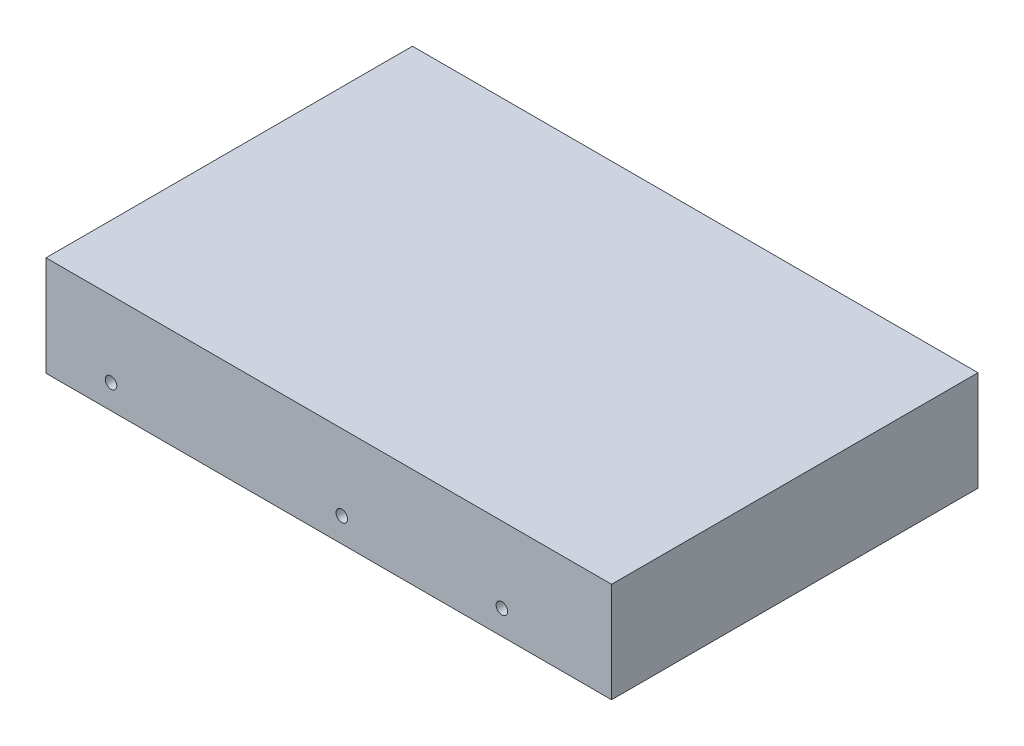
ISO-10303-21;
HEADER;
FILE_DESCRIPTION(('STEP AP214'),'2;1');
FILE_NAME('part.step','',(''),(''),'','','');
FILE_SCHEMA(('AUTOMOTIVE_DESIGN { 1 0 10303 214 1 1 1 1 }'));
ENDSEC;
DATA;
#1=APPLICATION_CONTEXT('core data for automotive mechanical design processes');
#2=APPLICATION_PROTOCOL_DEFINITION('international standard','automotive_design',2000,#1);
#3=PRODUCT_CONTEXT('',#1,'mechanical');
#4=PRODUCT('Part','Part','',(#3));
#5=PRODUCT_RELATED_PRODUCT_CATEGORY('part','',(#4));
#6=PRODUCT_DEFINITION_FORMATION('','',#4);
#7=PRODUCT_DEFINITION_CONTEXT('part definition',#1,'design');
#8=PRODUCT_DEFINITION('design','',#6,#7);
#9=PRODUCT_DEFINITION_SHAPE('','',#8);
#10=(LENGTH_UNIT() NAMED_UNIT(*) SI_UNIT(.MILLI.,.METRE.));
#11=(NAMED_UNIT(*) PLANE_ANGLE_UNIT() SI_UNIT($,.RADIAN.));
#12=(NAMED_UNIT(*) SI_UNIT($,.STERADIAN.) SOLID_ANGLE_UNIT());
#13=UNCERTAINTY_MEASURE_WITH_UNIT(LENGTH_MEASURE(1.E-05),#10,'distance_accuracy_value','');
#14=(GEOMETRIC_REPRESENTATION_CONTEXT(3) GLOBAL_UNCERTAINTY_ASSIGNED_CONTEXT((#13)) GLOBAL_UNIT_ASSIGNED_CONTEXT((#10,
#11,#12)) REPRESENTATION_CONTEXT('',''));
#15=CARTESIAN_POINT('',(0.,0.,0.));
#16=DIRECTION('',(0.,0.,1.));
#17=DIRECTION('',(1.,0.,0.));
#18=AXIS2_PLACEMENT_3D('',#15,#16,#17);
#19=CARTESIAN_POINT('',(-65.3799342105263,26.,-55.8758223684211));
#20=DIRECTION('',(1.,0.,0.));
#21=DIRECTION('',(0.,0.,-1.));
#22=AXIS2_PLACEMENT_3D('',#19,#20,#21);
#23=PLANE('',#22);
#24=DIRECTION('',(0.,0.,1.));
#25=VECTOR('',#24,1.);
#26=CARTESIAN_POINT('',(-65.3799342105263,0.,-55.8758223684211));
#27=LINE('',#26,#25);
#28=CARTESIAN_POINT('',(-65.3799342105263,0.,-55.8758223684211));
#29=VERTEX_POINT('',#28);
#30=CARTESIAN_POINT('',(-65.3799342105263,0.,39.3741776315789));
#31=VERTEX_POINT('',#30);
#32=EDGE_CURVE('E96',#29,#31,#27,.T.);
#33=ORIENTED_EDGE('',*,*,#32,.T.);
#34=DIRECTION('',(0.,-1.,0.));
#35=VECTOR('',#34,1.);
#36=CARTESIAN_POINT('',(-65.3799342105263,26.,39.3741776315789));
#37=LINE('',#36,#35);
#38=CARTESIAN_POINT('',(-65.3799342105263,26.,39.3741776315789));
#39=VERTEX_POINT('',#38);
#40=EDGE_CURVE('E11',#39,#31,#37,.T.);
#41=ORIENTED_EDGE('',*,*,#40,.F.);
#42=DIRECTION('',(0.,0.,1.));
#43=VECTOR('',#42,1.);
#44=CARTESIAN_POINT('',(-65.3799342105263,26.,-55.8758223684211));
#45=LINE('',#44,#43);
#46=CARTESIAN_POINT('',(-65.3799342105263,26.,-55.8758223684211));
#47=VERTEX_POINT('',#46);
#48=EDGE_CURVE('E84',#47,#39,#45,.T.);
#49=ORIENTED_EDGE('',*,*,#48,.F.);
#50=DIRECTION('',(0.,-1.,0.));
#51=VECTOR('',#50,1.);
#52=CARTESIAN_POINT('',(-65.3799342105263,26.,-55.8758223684211));
#53=LINE('',#52,#51);
#54=EDGE_CURVE('E92',#47,#29,#53,.T.);
#55=ORIENTED_EDGE('',*,*,#54,.T.);
#56=EDGE_LOOP('',(#33,#41,#49,#55));
#57=FACE_BOUND('',#56,.T.);
#58=ADVANCED_FACE('F33',(#57),#23,.F.);
#59=CARTESIAN_POINT('',(-65.3799342105263,26.,39.3741776315789));
#60=DIRECTION('',(0.,0.,-1.));
#61=DIRECTION('',(-1.,0.,0.));
#62=AXIS2_PLACEMENT_3D('',#59,#60,#61);
#63=PLANE('',#62);
#64=CARTESIAN_POINT('',(11.5100657894737,6.34999999999999,39.3741776315789));
#65=DIRECTION('',(0.,0.,1.));
#66=DIRECTION('',(1.,0.,0.));
#67=AXIS2_PLACEMENT_3D('',#64,#65,#66);
#68=CIRCLE('',#67,1.5);
#69=CARTESIAN_POINT('',(13.0100657894737,6.34999999999999,39.3741776315789));
#70=VERTEX_POINT('',#69);
#71=EDGE_CURVE('E113',#70,#70,#68,.T.);
#72=ORIENTED_EDGE('',*,*,#71,.F.);
#73=EDGE_LOOP('',(#72));
#74=FACE_BOUND('',#73,.T.);
#75=CARTESIAN_POINT('',(-48.4799342105263,6.34999999999999,39.3741776315789));
#76=DIRECTION('',(0.,0.,1.));
#77=DIRECTION('',(1.,0.,0.));
#78=AXIS2_PLACEMENT_3D('',#75,#76,#77);
#79=CIRCLE('',#78,1.5);
#80=CARTESIAN_POINT('',(-46.9799342105263,6.34999999999999,39.3741776315789));
#81=VERTEX_POINT('',#80);
#82=EDGE_CURVE('E119',#81,#81,#79,.T.);
#83=ORIENTED_EDGE('',*,*,#82,.F.);
#84=EDGE_LOOP('',(#83));
#85=FACE_BOUND('',#84,.T.);
#86=CARTESIAN_POINT('',(53.1200657894737,6.35,39.3741776315789));
#87=DIRECTION('',(0.,0.,1.));
#88=DIRECTION('',(1.,0.,0.));
#89=AXIS2_PLACEMENT_3D('',#86,#87,#88);
#90=CIRCLE('',#89,1.5);
#91=CARTESIAN_POINT('',(54.6200657894737,6.35,39.3741776315789));
#92=VERTEX_POINT('',#91);
#93=EDGE_CURVE('E110',#92,#92,#90,.T.);
#94=ORIENTED_EDGE('',*,*,#93,.F.);
#95=EDGE_LOOP('',(#94));
#96=FACE_BOUND('',#95,.T.);
#97=DIRECTION('',(1.,0.,0.));
#98=VECTOR('',#97,1.);
#99=CARTESIAN_POINT('',(-65.3799342105263,0.,39.3741776315789));
#100=LINE('',#99,#98);
#101=CARTESIAN_POINT('',(81.6200657894737,0.,39.3741776315789));
#102=VERTEX_POINT('',#101);
#103=EDGE_CURVE('E88',#31,#102,#100,.T.);
#104=ORIENTED_EDGE('',*,*,#103,.T.);
#105=DIRECTION('',(0.,-1.,0.));
#106=VECTOR('',#105,1.);
#107=CARTESIAN_POINT('',(81.6200657894737,26.,39.3741776315789));
#108=LINE('',#107,#106);
#109=CARTESIAN_POINT('',(81.6200657894737,26.,39.3741776315789));
#110=VERTEX_POINT('',#109);
#111=EDGE_CURVE('E41',#110,#102,#108,.T.);
#112=ORIENTED_EDGE('',*,*,#111,.F.);
#113=DIRECTION('',(1.,0.,0.));
#114=VECTOR('',#113,1.);
#115=CARTESIAN_POINT('',(-65.3799342105263,26.,39.3741776315789));
#116=LINE('',#115,#114);
#117=EDGE_CURVE('E79',#39,#110,#116,.T.);
#118=ORIENTED_EDGE('',*,*,#117,.F.);
#119=ORIENTED_EDGE('',*,*,#40,.T.);
#120=EDGE_LOOP('',(#104,#112,#118,#119));
#121=FACE_BOUND('',#120,.T.);
#122=ADVANCED_FACE('F87',(#74,#85,#96,#121),#63,.F.);
#123=CARTESIAN_POINT('',(81.6200657894737,26.,-55.8758223684211));
#124=DIRECTION('',(-1.,0.,0.));
#125=DIRECTION('',(0.,0.,1.));
#126=AXIS2_PLACEMENT_3D('',#123,#124,#125);
#127=PLANE('',#126);
#128=DIRECTION('',(0.,0.,-1.));
#129=VECTOR('',#128,1.);
#130=CARTESIAN_POINT('',(81.6200657894737,0.,-55.8758223684211));
#131=LINE('',#130,#129);
#132=CARTESIAN_POINT('',(81.6200657894737,0.,-55.8758223684211));
#133=VERTEX_POINT('',#132);
#134=EDGE_CURVE('E66',#102,#133,#131,.T.);
#135=ORIENTED_EDGE('',*,*,#134,.T.);
#136=DIRECTION('',(0.,-1.,0.));
#137=VECTOR('',#136,1.);
#138=CARTESIAN_POINT('',(81.6200657894737,26.,-55.8758223684211));
#139=LINE('',#138,#137);
#140=CARTESIAN_POINT('',(81.6200657894737,26.,-55.8758223684211));
#141=VERTEX_POINT('',#140);
#142=EDGE_CURVE('E89',#141,#133,#139,.T.);
#143=ORIENTED_EDGE('',*,*,#142,.F.);
#144=DIRECTION('',(0.,0.,-1.));
#145=VECTOR('',#144,1.);
#146=CARTESIAN_POINT('',(81.6200657894737,26.,-55.8758223684211));
#147=LINE('',#146,#145);
#148=EDGE_CURVE('E82',#110,#141,#147,.T.);
#149=ORIENTED_EDGE('',*,*,#148,.F.);
#150=ORIENTED_EDGE('',*,*,#111,.T.);
#151=EDGE_LOOP('',(#135,#143,#149,#150));
#152=FACE_BOUND('',#151,.T.);
#153=ADVANCED_FACE('F90',(#152),#127,.F.);
#154=CARTESIAN_POINT('',(-65.3799342105263,26.,-55.8758223684211));
#155=DIRECTION('',(0.,0.,1.));
#156=DIRECTION('',(1.,0.,0.));
#157=AXIS2_PLACEMENT_3D('',#154,#155,#156);
#158=PLANE('',#157);
#159=DIRECTION('',(-1.,0.,0.));
#160=VECTOR('',#159,1.);
#161=CARTESIAN_POINT('',(-65.3799342105263,0.,-55.8758223684211));
#162=LINE('',#161,#160);
#163=EDGE_CURVE('E72',#133,#29,#162,.T.);
#164=ORIENTED_EDGE('',*,*,#163,.T.);
#165=ORIENTED_EDGE('',*,*,#54,.F.);
#166=DIRECTION('',(-1.,0.,0.));
#167=VECTOR('',#166,1.);
#168=CARTESIAN_POINT('',(-65.3799342105263,26.,-55.8758223684211));
#169=LINE('',#168,#167);
#170=EDGE_CURVE('E49',#141,#47,#169,.T.);
#171=ORIENTED_EDGE('',*,*,#170,.F.);
#172=ORIENTED_EDGE('',*,*,#142,.T.);
#173=EDGE_LOOP('',(#164,#165,#171,#172));
#174=FACE_BOUND('',#173,.T.);
#175=ADVANCED_FACE('F104',(#174),#158,.F.);
#176=CARTESIAN_POINT('',(0.,26.,0.));
#177=DIRECTION('',(0.,1.,0.));
#178=DIRECTION('',(0.,0.,1.));
#179=AXIS2_PLACEMENT_3D('',#176,#177,#178);
#180=PLANE('',#179);
#181=ORIENTED_EDGE('',*,*,#48,.T.);
#182=ORIENTED_EDGE('',*,*,#117,.T.);
#183=ORIENTED_EDGE('',*,*,#148,.T.);
#184=ORIENTED_EDGE('',*,*,#170,.T.);
#185=EDGE_LOOP('',(#181,#182,#183,#184));
#186=FACE_BOUND('',#185,.T.);
#187=ADVANCED_FACE('F80',(#186),#180,.T.);
#188=CARTESIAN_POINT('',(0.,0.,0.));
#189=DIRECTION('',(0.,1.,0.));
#190=DIRECTION('',(0.,0.,1.));
#191=AXIS2_PLACEMENT_3D('',#188,#189,#190);
#192=PLANE('',#191);
#193=ORIENTED_EDGE('',*,*,#32,.F.);
#194=ORIENTED_EDGE('',*,*,#163,.F.);
#195=ORIENTED_EDGE('',*,*,#134,.F.);
#196=ORIENTED_EDGE('',*,*,#103,.F.);
#197=EDGE_LOOP('',(#193,#194,#195,#196));
#198=FACE_BOUND('',#197,.T.);
#199=ADVANCED_FACE('F107',(#198),#192,.F.);
#200=CARTESIAN_POINT('',(53.1200657894737,6.35,13.3741776315789));
#201=DIRECTION('',(0.,0.,1.));
#202=DIRECTION('',(1.,0.,0.));
#203=AXIS2_PLACEMENT_3D('',#200,#201,#202);
#204=CYLINDRICAL_SURFACE('',#203,1.5);
#205=CARTESIAN_POINT('',(53.1200657894737,6.35,13.3741776315789));
#206=DIRECTION('',(0.,0.,1.));
#207=DIRECTION('',(1.,0.,0.));
#208=AXIS2_PLACEMENT_3D('',#205,#206,#207);
#209=CIRCLE('',#208,1.5);
#210=CARTESIAN_POINT('',(54.6200657894737,6.35,13.3741776315789));
#211=VERTEX_POINT('',#210);
#212=EDGE_CURVE('E99',#211,#211,#209,.T.);
#213=CARTESIAN_POINT('',(54.6200657894737,6.35,13.3741776315789));
#214=CARTESIAN_POINT('',(54.6200657894737,6.35,13.6450109649123));
#215=CARTESIAN_POINT('',(54.6200657894737,6.35,13.9158442982456));
#216=CARTESIAN_POINT('',(54.6200657894737,6.35,14.4575109649123));
#217=CARTESIAN_POINT('',(54.6200657894737,6.35,14.7283442982456));
#218=CARTESIAN_POINT('',(54.6200657894737,6.35,15.2700109649123));
#219=CARTESIAN_POINT('',(54.6200657894737,6.35,15.5408442982456));
#220=CARTESIAN_POINT('',(54.6200657894737,6.35,16.0825109649123));
#221=CARTESIAN_POINT('',(54.6200657894737,6.35,16.3533442982456));
#222=CARTESIAN_POINT('',(54.6200657894737,6.35,16.8950109649123));
#223=CARTESIAN_POINT('',(54.6200657894737,6.35,17.1658442982456));
#224=CARTESIAN_POINT('',(54.6200657894737,6.35,17.7075109649123));
#225=CARTESIAN_POINT('',(54.6200657894737,6.35,17.9783442982456));
#226=CARTESIAN_POINT('',(54.6200657894737,6.35,18.5200109649123));
#227=CARTESIAN_POINT('',(54.6200657894737,6.35,18.7908442982456));
#228=CARTESIAN_POINT('',(54.6200657894737,6.35,19.3325109649123));
#229=CARTESIAN_POINT('',(54.6200657894737,6.35,19.6033442982456));
#230=CARTESIAN_POINT('',(54.6200657894737,6.35,20.1450109649123));
#231=CARTESIAN_POINT('',(54.6200657894737,6.35,20.4158442982456));
#232=CARTESIAN_POINT('',(54.6200657894737,6.35,20.9575109649123));
#233=CARTESIAN_POINT('',(54.6200657894737,6.35,21.2283442982456));
#234=CARTESIAN_POINT('',(54.6200657894737,6.35,21.7700109649123));
#235=CARTESIAN_POINT('',(54.6200657894737,6.35,22.0408442982456));
#236=CARTESIAN_POINT('',(54.6200657894737,6.35,22.5825109649123));
#237=CARTESIAN_POINT('',(54.6200657894737,6.35,22.8533442982456));
#238=CARTESIAN_POINT('',(54.6200657894737,6.35,23.3950109649123));
#239=CARTESIAN_POINT('',(54.6200657894737,6.35,23.6658442982456));
#240=CARTESIAN_POINT('',(54.6200657894737,6.35,24.2075109649123));
#241=CARTESIAN_POINT('',(54.6200657894737,6.35,24.4783442982456));
#242=CARTESIAN_POINT('',(54.6200657894737,6.35,25.0200109649123));
#243=CARTESIAN_POINT('',(54.6200657894737,6.35,25.2908442982456));
#244=CARTESIAN_POINT('',(54.6200657894737,6.35,25.8325109649123));
#245=CARTESIAN_POINT('',(54.6200657894737,6.35,26.1033442982456));
#246=CARTESIAN_POINT('',(54.6200657894737,6.35,26.6450109649123));
#247=CARTESIAN_POINT('',(54.6200657894737,6.35,26.9158442982456));
#248=CARTESIAN_POINT('',(54.6200657894737,6.35,27.4575109649123));
#249=CARTESIAN_POINT('',(54.6200657894737,6.35,27.7283442982456));
#250=CARTESIAN_POINT('',(54.6200657894737,6.35,28.2700109649123));
#251=CARTESIAN_POINT('',(54.6200657894737,6.35,28.5408442982456));
#252=CARTESIAN_POINT('',(54.6200657894737,6.35,29.0825109649123));
#253=CARTESIAN_POINT('',(54.6200657894737,6.35,29.3533442982456));
#254=CARTESIAN_POINT('',(54.6200657894737,6.35,29.8950109649123));
#255=CARTESIAN_POINT('',(54.6200657894737,6.35,30.1658442982456));
#256=CARTESIAN_POINT('',(54.6200657894737,6.35,30.7075109649123));
#257=CARTESIAN_POINT('',(54.6200657894737,6.35,30.9783442982456));
#258=CARTESIAN_POINT('',(54.6200657894737,6.35,31.5200109649123));
#259=CARTESIAN_POINT('',(54.6200657894737,6.35,31.7908442982456));
#260=CARTESIAN_POINT('',(54.6200657894737,6.35,32.3325109649123));
#261=CARTESIAN_POINT('',(54.6200657894737,6.35,32.6033442982456));
#262=CARTESIAN_POINT('',(54.6200657894737,6.35,33.1450109649123));
#263=CARTESIAN_POINT('',(54.6200657894737,6.35,33.4158442982456));
#264=CARTESIAN_POINT('',(54.6200657894737,6.35,33.9575109649123));
#265=CARTESIAN_POINT('',(54.6200657894737,6.35,34.2283442982456));
#266=CARTESIAN_POINT('',(54.6200657894737,6.35,34.7700109649123));
#267=CARTESIAN_POINT('',(54.6200657894737,6.35,35.0408442982456));
#268=CARTESIAN_POINT('',(54.6200657894737,6.35,35.5825109649123));
#269=CARTESIAN_POINT('',(54.6200657894737,6.35,35.8533442982456));
#270=CARTESIAN_POINT('',(54.6200657894737,6.35,36.3950109649123));
#271=CARTESIAN_POINT('',(54.6200657894737,6.35,36.6658442982456));
#272=CARTESIAN_POINT('',(54.6200657894737,6.35,37.2075109649123));
#273=CARTESIAN_POINT('',(54.6200657894737,6.35,37.4783442982456));
#274=CARTESIAN_POINT('',(54.6200657894737,6.35,38.0200109649123));
#275=CARTESIAN_POINT('',(54.6200657894737,6.35,38.2908442982456));
#276=CARTESIAN_POINT('',(54.6200657894737,6.35,38.8325109649123));
#277=CARTESIAN_POINT('',(54.6200657894737,6.35,39.1033442982456));
#278=CARTESIAN_POINT('',(54.6200657894737,6.35,39.3741776315789));
#279=B_SPLINE_CURVE_WITH_KNOTS('',3,(#213,#214,#215,#216,#217,#218,#219,#220,#221,#222,#223,
#224,#225,#226,#227,#228,#229,#230,#231,#232,#233,#234,#235,#236,#237,#238,#239,#240,#241,#242,
#243,#244,#245,#246,#247,#248,#249,#250,#251,#252,#253,#254,#255,#256,#257,#258,#259,#260,#261,
#262,#263,#264,#265,#266,#267,#268,#269,#270,#271,#272,#273,#274,#275,#276,#277,#278),
.UNSPECIFIED.,.F.,.F.,(4,2,2,2,2,2,2,2,2,2,2,2,2,2,2,2,2,2,2,2,2,2,2,2,2,2,2,2,2,2,2,2,4),(0.,
0.812500000000001,1.625,2.4375,3.25,4.0625,4.875,5.6875,6.5,7.3125,8.125,8.9375,9.75,10.5625,
11.375,12.1875,13.,13.8125,14.625,15.4375,16.25,17.0625,17.875,18.6875,19.5,20.3125,21.125,
21.9375,22.75,23.5625,24.375,25.1875,26.),.UNSPECIFIED.);
#280=EDGE_CURVE('BSEAM136',#211,#92,#279,.T.);
#281=ORIENTED_EDGE('',*,*,#212,.F.);
#282=ORIENTED_EDGE('',*,*,#93,.T.);
#283=ORIENTED_EDGE('',*,*,#280,.T.);
#284=ORIENTED_EDGE('',*,*,#280,.F.);
#285=EDGE_LOOP('',(#281,#283,#282,#284));
#286=FACE_BOUND('',#285,.T.);
#287=ADVANCED_FACE('F136',(#286),#204,.F.);
#288=CARTESIAN_POINT('',(53.1200657894737,6.35,13.3741776315789));
#289=DIRECTION('',(0.,0.,1.));
#290=DIRECTION('',(1.,0.,0.));
#291=AXIS2_PLACEMENT_3D('',#288,#289,#290);
#292=PLANE('',#291);
#293=ORIENTED_EDGE('',*,*,#212,.T.);
#294=EDGE_LOOP('',(#293));
#295=FACE_BOUND('',#294,.T.);
#296=ADVANCED_FACE('F138',(#295),#292,.T.);
#297=CARTESIAN_POINT('',(-48.4799342105263,6.34999999999999,13.3741776315789));
#298=DIRECTION('',(0.,0.,1.));
#299=DIRECTION('',(1.,0.,0.));
#300=AXIS2_PLACEMENT_3D('',#297,#298,#299);
#301=CYLINDRICAL_SURFACE('',#300,1.5);
#302=CARTESIAN_POINT('',(-48.4799342105263,6.34999999999999,13.3741776315789));
#303=DIRECTION('',(0.,0.,1.));
#304=DIRECTION('',(1.,0.,0.));
#305=AXIS2_PLACEMENT_3D('',#302,#303,#304);
#306=CIRCLE('',#305,1.5);
#307=CARTESIAN_POINT('',(-46.9799342105263,6.34999999999999,13.3741776315789));
#308=VERTEX_POINT('',#307);
#309=EDGE_CURVE('E116',#308,#308,#306,.T.);
#310=CARTESIAN_POINT('',(-46.9799342105263,6.34999999999999,13.3741776315789));
#311=CARTESIAN_POINT('',(-46.9799342105263,6.34999999999999,13.6450109649123));
#312=CARTESIAN_POINT('',(-46.9799342105263,6.34999999999999,13.9158442982456));
#313=CARTESIAN_POINT('',(-46.9799342105263,6.34999999999999,14.4575109649123));
#314=CARTESIAN_POINT('',(-46.9799342105263,6.34999999999999,14.7283442982456));
#315=CARTESIAN_POINT('',(-46.9799342105263,6.34999999999999,15.2700109649123));
#316=CARTESIAN_POINT('',(-46.9799342105263,6.34999999999999,15.5408442982456));
#317=CARTESIAN_POINT('',(-46.9799342105263,6.34999999999999,16.0825109649123));
#318=CARTESIAN_POINT('',(-46.9799342105263,6.34999999999999,16.3533442982456));
#319=CARTESIAN_POINT('',(-46.9799342105263,6.34999999999999,16.8950109649123));
#320=CARTESIAN_POINT('',(-46.9799342105263,6.34999999999999,17.1658442982456));
#321=CARTESIAN_POINT('',(-46.9799342105263,6.34999999999999,17.7075109649123));
#322=CARTESIAN_POINT('',(-46.9799342105263,6.34999999999999,17.9783442982456));
#323=CARTESIAN_POINT('',(-46.9799342105263,6.34999999999999,18.5200109649123));
#324=CARTESIAN_POINT('',(-46.9799342105263,6.34999999999999,18.7908442982456));
#325=CARTESIAN_POINT('',(-46.9799342105263,6.34999999999999,19.3325109649123));
#326=CARTESIAN_POINT('',(-46.9799342105263,6.34999999999999,19.6033442982456));
#327=CARTESIAN_POINT('',(-46.9799342105263,6.34999999999999,20.1450109649123));
#328=CARTESIAN_POINT('',(-46.9799342105263,6.34999999999999,20.4158442982456));
#329=CARTESIAN_POINT('',(-46.9799342105263,6.34999999999999,20.9575109649123));
#330=CARTESIAN_POINT('',(-46.9799342105263,6.34999999999999,21.2283442982456));
#331=CARTESIAN_POINT('',(-46.9799342105263,6.34999999999999,21.7700109649123));
#332=CARTESIAN_POINT('',(-46.9799342105263,6.34999999999999,22.0408442982456));
#333=CARTESIAN_POINT('',(-46.9799342105263,6.34999999999999,22.5825109649123));
#334=CARTESIAN_POINT('',(-46.9799342105263,6.34999999999999,22.8533442982456));
#335=CARTESIAN_POINT('',(-46.9799342105263,6.34999999999999,23.3950109649123));
#336=CARTESIAN_POINT('',(-46.9799342105263,6.34999999999999,23.6658442982456));
#337=CARTESIAN_POINT('',(-46.9799342105263,6.34999999999999,24.2075109649123));
#338=CARTESIAN_POINT('',(-46.9799342105263,6.34999999999999,24.4783442982456));
#339=CARTESIAN_POINT('',(-46.9799342105263,6.34999999999999,25.0200109649123));
#340=CARTESIAN_POINT('',(-46.9799342105263,6.34999999999999,25.2908442982456));
#341=CARTESIAN_POINT('',(-46.9799342105263,6.34999999999999,25.8325109649123));
#342=CARTESIAN_POINT('',(-46.9799342105263,6.34999999999999,26.1033442982456));
#343=CARTESIAN_POINT('',(-46.9799342105263,6.34999999999999,26.6450109649123));
#344=CARTESIAN_POINT('',(-46.9799342105263,6.34999999999999,26.9158442982456));
#345=CARTESIAN_POINT('',(-46.9799342105263,6.34999999999999,27.4575109649123));
#346=CARTESIAN_POINT('',(-46.9799342105263,6.34999999999999,27.7283442982456));
#347=CARTESIAN_POINT('',(-46.9799342105263,6.34999999999999,28.2700109649123));
#348=CARTESIAN_POINT('',(-46.9799342105263,6.34999999999999,28.5408442982456));
#349=CARTESIAN_POINT('',(-46.9799342105263,6.34999999999999,29.0825109649123));
#350=CARTESIAN_POINT('',(-46.9799342105263,6.34999999999999,29.3533442982456));
#351=CARTESIAN_POINT('',(-46.9799342105263,6.34999999999999,29.8950109649123));
#352=CARTESIAN_POINT('',(-46.9799342105263,6.34999999999999,30.1658442982456));
#353=CARTESIAN_POINT('',(-46.9799342105263,6.34999999999999,30.7075109649123));
#354=CARTESIAN_POINT('',(-46.9799342105263,6.34999999999999,30.9783442982456));
#355=CARTESIAN_POINT('',(-46.9799342105263,6.34999999999999,31.5200109649123));
#356=CARTESIAN_POINT('',(-46.9799342105263,6.34999999999999,31.7908442982456));
#357=CARTESIAN_POINT('',(-46.9799342105263,6.34999999999999,32.3325109649123));
#358=CARTESIAN_POINT('',(-46.9799342105263,6.34999999999999,32.6033442982456));
#359=CARTESIAN_POINT('',(-46.9799342105263,6.34999999999999,33.1450109649123));
#360=CARTESIAN_POINT('',(-46.9799342105263,6.34999999999999,33.4158442982456));
#361=CARTESIAN_POINT('',(-46.9799342105263,6.34999999999999,33.9575109649123));
#362=CARTESIAN_POINT('',(-46.9799342105263,6.34999999999999,34.2283442982456));
#363=CARTESIAN_POINT('',(-46.9799342105263,6.34999999999999,34.7700109649123));
#364=CARTESIAN_POINT('',(-46.9799342105263,6.34999999999999,35.0408442982456));
#365=CARTESIAN_POINT('',(-46.9799342105263,6.34999999999999,35.5825109649123));
#366=CARTESIAN_POINT('',(-46.9799342105263,6.34999999999999,35.8533442982456));
#367=CARTESIAN_POINT('',(-46.9799342105263,6.34999999999999,36.3950109649123));
#368=CARTESIAN_POINT('',(-46.9799342105263,6.34999999999999,36.6658442982456));
#369=CARTESIAN_POINT('',(-46.9799342105263,6.34999999999999,37.2075109649123));
#370=CARTESIAN_POINT('',(-46.9799342105263,6.34999999999999,37.4783442982456));
#371=CARTESIAN_POINT('',(-46.9799342105263,6.34999999999999,38.0200109649123));
#372=CARTESIAN_POINT('',(-46.9799342105263,6.34999999999999,38.2908442982456));
#373=CARTESIAN_POINT('',(-46.9799342105263,6.34999999999999,38.8325109649123));
#374=CARTESIAN_POINT('',(-46.9799342105263,6.34999999999999,39.1033442982456));
#375=CARTESIAN_POINT('',(-46.9799342105263,6.34999999999999,39.3741776315789));
#376=B_SPLINE_CURVE_WITH_KNOTS('',3,(#310,#311,#312,#313,#314,#315,#316,#317,#318,#319,#320,
#321,#322,#323,#324,#325,#326,#327,#328,#329,#330,#331,#332,#333,#334,#335,#336,#337,#338,#339,
#340,#341,#342,#343,#344,#345,#346,#347,#348,#349,#350,#351,#352,#353,#354,#355,#356,#357,#358,
#359,#360,#361,#362,#363,#364,#365,#366,#367,#368,#369,#370,#371,#372,#373,#374,#375),
.UNSPECIFIED.,.F.,.F.,(4,2,2,2,2,2,2,2,2,2,2,2,2,2,2,2,2,2,2,2,2,2,2,2,2,2,2,2,2,2,2,2,4),(0.,
0.812500000000001,1.625,2.4375,3.25,4.0625,4.875,5.6875,6.5,7.3125,8.125,8.9375,9.75,10.5625,
11.375,12.1875,13.,13.8125,14.625,15.4375,16.25,17.0625,17.875,18.6875,19.5,20.3125,21.125,
21.9375,22.75,23.5625,24.375,25.1875,26.),.UNSPECIFIED.);
#377=EDGE_CURVE('BSEAM145',#308,#81,#376,.T.);
#378=ORIENTED_EDGE('',*,*,#309,.F.);
#379=ORIENTED_EDGE('',*,*,#82,.T.);
#380=ORIENTED_EDGE('',*,*,#377,.T.);
#381=ORIENTED_EDGE('',*,*,#377,.F.);
#382=EDGE_LOOP('',(#378,#380,#379,#381));
#383=FACE_BOUND('',#382,.T.);
#384=ADVANCED_FACE('F145',(#383),#301,.F.);
#385=CARTESIAN_POINT('',(-48.4799342105263,6.34999999999999,13.3741776315789));
#386=DIRECTION('',(0.,0.,1.));
#387=DIRECTION('',(1.,0.,0.));
#388=AXIS2_PLACEMENT_3D('',#385,#386,#387);
#389=PLANE('',#388);
#390=ORIENTED_EDGE('',*,*,#309,.T.);
#391=EDGE_LOOP('',(#390));
#392=FACE_BOUND('',#391,.T.);
#393=ADVANCED_FACE('F200',(#392),#389,.T.);
#394=CARTESIAN_POINT('',(11.5100657894737,6.34999999999999,13.3741776315789));
#395=DIRECTION('',(0.,0.,1.));
#396=DIRECTION('',(1.,0.,0.));
#397=AXIS2_PLACEMENT_3D('',#394,#395,#396);
#398=CYLINDRICAL_SURFACE('',#397,1.5);
#399=CARTESIAN_POINT('',(11.5100657894737,6.34999999999999,13.3741776315789));
#400=DIRECTION('',(0.,0.,1.));
#401=DIRECTION('',(1.,0.,0.));
#402=AXIS2_PLACEMENT_3D('',#399,#400,#401);
#403=CIRCLE('',#402,1.5);
#404=CARTESIAN_POINT('',(13.0100657894737,6.34999999999999,13.3741776315789));
#405=VERTEX_POINT('',#404);
#406=EDGE_CURVE('E122',#405,#405,#403,.T.);
#407=CARTESIAN_POINT('',(13.0100657894737,6.34999999999999,13.3741776315789));
#408=CARTESIAN_POINT('',(13.0100657894737,6.34999999999999,13.6450109649123));
#409=CARTESIAN_POINT('',(13.0100657894737,6.34999999999999,13.9158442982456));
#410=CARTESIAN_POINT('',(13.0100657894737,6.34999999999999,14.4575109649123));
#411=CARTESIAN_POINT('',(13.0100657894737,6.34999999999999,14.7283442982456));
#412=CARTESIAN_POINT('',(13.0100657894737,6.34999999999999,15.2700109649123));
#413=CARTESIAN_POINT('',(13.0100657894737,6.34999999999999,15.5408442982456));
#414=CARTESIAN_POINT('',(13.0100657894737,6.34999999999999,16.0825109649123));
#415=CARTESIAN_POINT('',(13.0100657894737,6.34999999999999,16.3533442982456));
#416=CARTESIAN_POINT('',(13.0100657894737,6.34999999999999,16.8950109649123));
#417=CARTESIAN_POINT('',(13.0100657894737,6.34999999999999,17.1658442982456));
#418=CARTESIAN_POINT('',(13.0100657894737,6.34999999999999,17.7075109649123));
#419=CARTESIAN_POINT('',(13.0100657894737,6.34999999999999,17.9783442982456));
#420=CARTESIAN_POINT('',(13.0100657894737,6.34999999999999,18.5200109649123));
#421=CARTESIAN_POINT('',(13.0100657894737,6.34999999999999,18.7908442982456));
#422=CARTESIAN_POINT('',(13.0100657894737,6.34999999999999,19.3325109649123));
#423=CARTESIAN_POINT('',(13.0100657894737,6.34999999999999,19.6033442982456));
#424=CARTESIAN_POINT('',(13.0100657894737,6.34999999999999,20.1450109649123));
#425=CARTESIAN_POINT('',(13.0100657894737,6.34999999999999,20.4158442982456));
#426=CARTESIAN_POINT('',(13.0100657894737,6.34999999999999,20.9575109649123));
#427=CARTESIAN_POINT('',(13.0100657894737,6.34999999999999,21.2283442982456));
#428=CARTESIAN_POINT('',(13.0100657894737,6.34999999999999,21.7700109649123));
#429=CARTESIAN_POINT('',(13.0100657894737,6.34999999999999,22.0408442982456));
#430=CARTESIAN_POINT('',(13.0100657894737,6.34999999999999,22.5825109649123));
#431=CARTESIAN_POINT('',(13.0100657894737,6.34999999999999,22.8533442982456));
#432=CARTESIAN_POINT('',(13.0100657894737,6.34999999999999,23.3950109649123));
#433=CARTESIAN_POINT('',(13.0100657894737,6.34999999999999,23.6658442982456));
#434=CARTESIAN_POINT('',(13.0100657894737,6.34999999999999,24.2075109649123));
#435=CARTESIAN_POINT('',(13.0100657894737,6.34999999999999,24.4783442982456));
#436=CARTESIAN_POINT('',(13.0100657894737,6.34999999999999,25.0200109649123));
#437=CARTESIAN_POINT('',(13.0100657894737,6.34999999999999,25.2908442982456));
#438=CARTESIAN_POINT('',(13.0100657894737,6.34999999999999,25.8325109649123));
#439=CARTESIAN_POINT('',(13.0100657894737,6.34999999999999,26.1033442982456));
#440=CARTESIAN_POINT('',(13.0100657894737,6.34999999999999,26.6450109649123));
#441=CARTESIAN_POINT('',(13.0100657894737,6.34999999999999,26.9158442982456));
#442=CARTESIAN_POINT('',(13.0100657894737,6.34999999999999,27.4575109649123));
#443=CARTESIAN_POINT('',(13.0100657894737,6.34999999999999,27.7283442982456));
#444=CARTESIAN_POINT('',(13.0100657894737,6.34999999999999,28.2700109649123));
#445=CARTESIAN_POINT('',(13.0100657894737,6.34999999999999,28.5408442982456));
#446=CARTESIAN_POINT('',(13.0100657894737,6.34999999999999,29.0825109649123));
#447=CARTESIAN_POINT('',(13.0100657894737,6.34999999999999,29.3533442982456));
#448=CARTESIAN_POINT('',(13.0100657894737,6.34999999999999,29.8950109649123));
#449=CARTESIAN_POINT('',(13.0100657894737,6.34999999999999,30.1658442982456));
#450=CARTESIAN_POINT('',(13.0100657894737,6.34999999999999,30.7075109649123));
#451=CARTESIAN_POINT('',(13.0100657894737,6.34999999999999,30.9783442982456));
#452=CARTESIAN_POINT('',(13.0100657894737,6.34999999999999,31.5200109649123));
#453=CARTESIAN_POINT('',(13.0100657894737,6.34999999999999,31.7908442982456));
#454=CARTESIAN_POINT('',(13.0100657894737,6.34999999999999,32.3325109649123));
#455=CARTESIAN_POINT('',(13.0100657894737,6.34999999999999,32.6033442982456));
#456=CARTESIAN_POINT('',(13.0100657894737,6.34999999999999,33.1450109649123));
#457=CARTESIAN_POINT('',(13.0100657894737,6.34999999999999,33.4158442982456));
#458=CARTESIAN_POINT('',(13.0100657894737,6.34999999999999,33.9575109649123));
#459=CARTESIAN_POINT('',(13.0100657894737,6.34999999999999,34.2283442982456));
#460=CARTESIAN_POINT('',(13.0100657894737,6.34999999999999,34.7700109649123));
#461=CARTESIAN_POINT('',(13.0100657894737,6.34999999999999,35.0408442982456));
#462=CARTESIAN_POINT('',(13.0100657894737,6.34999999999999,35.5825109649123));
#463=CARTESIAN_POINT('',(13.0100657894737,6.34999999999999,35.8533442982456));
#464=CARTESIAN_POINT('',(13.0100657894737,6.34999999999999,36.3950109649123));
#465=CARTESIAN_POINT('',(13.0100657894737,6.34999999999999,36.6658442982456));
#466=CARTESIAN_POINT('',(13.0100657894737,6.34999999999999,37.2075109649123));
#467=CARTESIAN_POINT('',(13.0100657894737,6.34999999999999,37.4783442982456));
#468=CARTESIAN_POINT('',(13.0100657894737,6.34999999999999,38.0200109649123));
#469=CARTESIAN_POINT('',(13.0100657894737,6.34999999999999,38.2908442982456));
#470=CARTESIAN_POINT('',(13.0100657894737,6.34999999999999,38.8325109649123));
#471=CARTESIAN_POINT('',(13.0100657894737,6.34999999999999,39.1033442982456));
#472=CARTESIAN_POINT('',(13.0100657894737,6.34999999999999,39.3741776315789));
#473=B_SPLINE_CURVE_WITH_KNOTS('',3,(#407,#408,#409,#410,#411,#412,#413,#414,#415,#416,#417,
#418,#419,#420,#421,#422,#423,#424,#425,#426,#427,#428,#429,#430,#431,#432,#433,#434,#435,#436,
#437,#438,#439,#440,#441,#442,#443,#444,#445,#446,#447,#448,#449,#450,#451,#452,#453,#454,#455,
#456,#457,#458,#459,#460,#461,#462,#463,#464,#465,#466,#467,#468,#469,#470,#471,#472),
.UNSPECIFIED.,.F.,.F.,(4,2,2,2,2,2,2,2,2,2,2,2,2,2,2,2,2,2,2,2,2,2,2,2,2,2,2,2,2,2,2,2,4),(0.,
0.812500000000001,1.625,2.4375,3.25,4.0625,4.875,5.6875,6.5,7.3125,8.125,8.9375,9.75,10.5625,
11.375,12.1875,13.,13.8125,14.625,15.4375,16.25,17.0625,17.875,18.6875,19.5,20.3125,21.125,
21.9375,22.75,23.5625,24.375,25.1875,26.),.UNSPECIFIED.);
#474=EDGE_CURVE('BSEAM128',#405,#70,#473,.T.);
#475=ORIENTED_EDGE('',*,*,#406,.F.);
#476=ORIENTED_EDGE('',*,*,#71,.T.);
#477=ORIENTED_EDGE('',*,*,#474,.T.);
#478=ORIENTED_EDGE('',*,*,#474,.F.);
#479=EDGE_LOOP('',(#475,#477,#476,#478));
#480=FACE_BOUND('',#479,.T.);
#481=ADVANCED_FACE('F128',(#480),#398,.F.);
#482=CARTESIAN_POINT('',(11.5100657894737,6.34999999999999,13.3741776315789));
#483=DIRECTION('',(0.,0.,1.));
#484=DIRECTION('',(1.,0.,0.));
#485=AXIS2_PLACEMENT_3D('',#482,#483,#484);
#486=PLANE('',#485);
#487=ORIENTED_EDGE('',*,*,#406,.T.);
#488=EDGE_LOOP('',(#487));
#489=FACE_BOUND('',#488,.T.);
#490=ADVANCED_FACE('F217',(#489),#486,.T.);
#491=CLOSED_SHELL('',(#58,#122,#153,#175,#187,#199,#287,#296,#384,#393,#481,#490));
#492=MANIFOLD_SOLID_BREP('B2',#491);
#493=ADVANCED_BREP_SHAPE_REPRESENTATION('',(#18,#492),#14);
#494=SHAPE_DEFINITION_REPRESENTATION(#9,#493);
ENDSEC;
END-ISO-10303-21;
